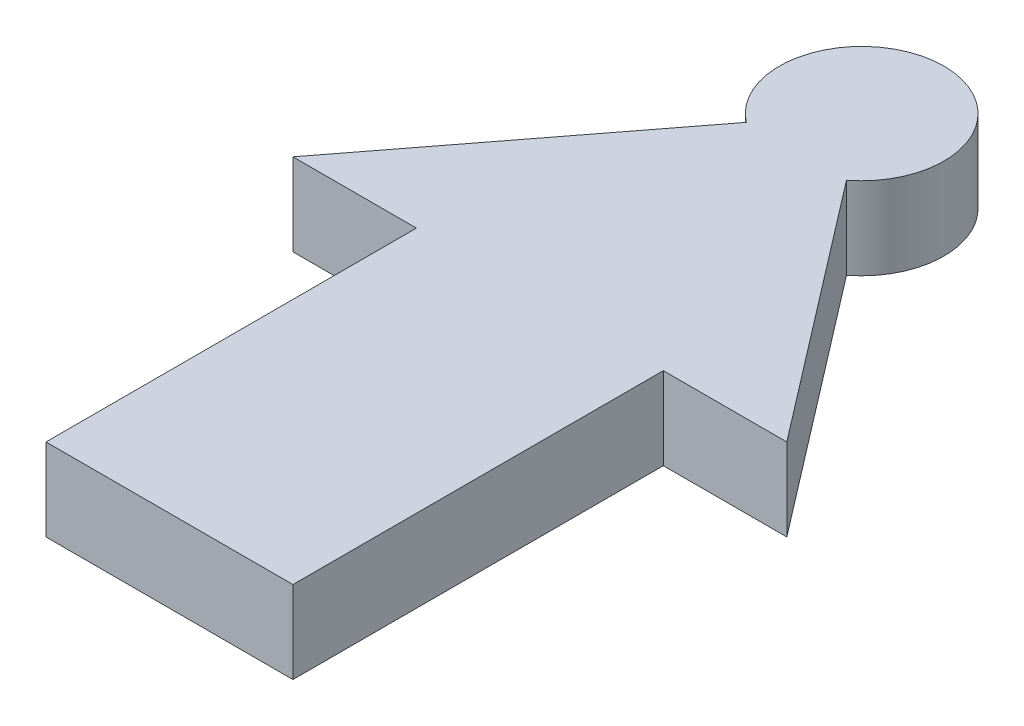
ISO-10303-21;
HEADER;
FILE_DESCRIPTION(('STEP AP214'),'2;1');
FILE_NAME('part.step','',(''),(''),'','','');
FILE_SCHEMA(('AUTOMOTIVE_DESIGN { 1 0 10303 214 1 1 1 1 }'));
ENDSEC;
DATA;
#1=APPLICATION_CONTEXT('core data for automotive mechanical design processes');
#2=APPLICATION_PROTOCOL_DEFINITION('international standard','automotive_design',2000,#1);
#3=PRODUCT_CONTEXT('',#1,'mechanical');
#4=PRODUCT('Part','Part','',(#3));
#5=PRODUCT_RELATED_PRODUCT_CATEGORY('part','',(#4));
#6=PRODUCT_DEFINITION_FORMATION('','',#4);
#7=PRODUCT_DEFINITION_CONTEXT('part definition',#1,'design');
#8=PRODUCT_DEFINITION('design','',#6,#7);
#9=PRODUCT_DEFINITION_SHAPE('','',#8);
#10=(LENGTH_UNIT() NAMED_UNIT(*) SI_UNIT(.MILLI.,.METRE.));
#11=(NAMED_UNIT(*) PLANE_ANGLE_UNIT() SI_UNIT($,.RADIAN.));
#12=(NAMED_UNIT(*) SI_UNIT($,.STERADIAN.) SOLID_ANGLE_UNIT());
#13=UNCERTAINTY_MEASURE_WITH_UNIT(LENGTH_MEASURE(1.E-05),#10,'distance_accuracy_value','');
#14=(GEOMETRIC_REPRESENTATION_CONTEXT(3) GLOBAL_UNCERTAINTY_ASSIGNED_CONTEXT((#13)) GLOBAL_UNIT_ASSIGNED_CONTEXT((#10,
#11,#12)) REPRESENTATION_CONTEXT('',''));
#15=CARTESIAN_POINT('',(0.,0.,0.));
#16=DIRECTION('',(0.,0.,1.));
#17=DIRECTION('',(1.,0.,0.));
#18=AXIS2_PLACEMENT_3D('',#15,#16,#17);
#19=CARTESIAN_POINT('',(75.5623361046163,25.4,-57.9810197678088));
#20=DIRECTION('',(-0.793353340291236,0.,0.608761429008719));
#21=DIRECTION('',(0.608761429008719,0.,0.793353340291236));
#22=AXIS2_PLACEMENT_3D('',#19,#20,#21);
#23=PLANE('',#22);
#24=DIRECTION('',(-0.608761429008719,0.,-0.793353340291236));
#25=VECTOR('',#24,1.);
#26=CARTESIAN_POINT('',(75.5623361046163,0.,-57.9810197678088));
#27=LINE('',#26,#25);
#28=CARTESIAN_POINT('',(76.2,0.,-57.15));
#29=VERTEX_POINT('',#28);
#30=CARTESIAN_POINT('',(15.4625402968215,0.,-136.304598567103));
#31=VERTEX_POINT('',#30);
#32=EDGE_CURVE('E146',#29,#31,#27,.T.);
#33=ORIENTED_EDGE('',*,*,#32,.T.);
#34=DIRECTION('',(0.,-1.,0.));
#35=VECTOR('',#34,1.);
#36=CARTESIAN_POINT('',(15.4625402968215,25.4,-136.304598567103));
#37=LINE('',#36,#35);
#38=CARTESIAN_POINT('',(15.4625402968215,25.4,-136.304598567103));
#39=VERTEX_POINT('',#38);
#40=EDGE_CURVE('E11',#39,#31,#37,.T.);
#41=ORIENTED_EDGE('',*,*,#40,.F.);
#42=DIRECTION('',(-0.608761429008719,0.,-0.793353340291236));
#43=VECTOR('',#42,1.);
#44=CARTESIAN_POINT('',(75.5623361046163,25.4,-57.9810197678088));
#45=LINE('',#44,#43);
#46=CARTESIAN_POINT('',(76.2,25.4,-57.15));
#47=VERTEX_POINT('',#46);
#48=EDGE_CURVE('E208',#47,#39,#45,.T.);
#49=ORIENTED_EDGE('',*,*,#48,.F.);
#50=DIRECTION('',(0.,-1.,0.));
#51=VECTOR('',#50,1.);
#52=CARTESIAN_POINT('',(76.2,25.4,-57.15));
#53=LINE('',#52,#51);
#54=EDGE_CURVE('E141',#47,#29,#53,.T.);
#55=ORIENTED_EDGE('',*,*,#54,.T.);
#56=EDGE_LOOP('',(#33,#41,#49,#55));
#57=FACE_BOUND('',#56,.T.);
#58=ADVANCED_FACE('F45',(#57),#23,.F.);
#59=CARTESIAN_POINT('',(0.,25.4,-156.4557734105));
#60=DIRECTION('',(0.,-1.,0.));
#61=DIRECTION('',(0.,0.,-1.));
#62=AXIS2_PLACEMENT_3D('',#59,#60,#61);
#63=CYLINDRICAL_SURFACE('',#62,25.4);
#64=CARTESIAN_POINT('',(0.,0.,-156.4557734105));
#65=DIRECTION('',(0.,1.,0.));
#66=DIRECTION('',(0.,0.,1.));
#67=AXIS2_PLACEMENT_3D('',#64,#65,#66);
#68=CIRCLE('',#67,25.4);
#69=CARTESIAN_POINT('',(-15.4625402968215,0.,-136.304598567103));
#70=VERTEX_POINT('',#69);
#71=EDGE_CURVE('E150',#31,#70,#68,.T.);
#72=ORIENTED_EDGE('',*,*,#71,.T.);
#73=DIRECTION('',(0.,-1.,0.));
#74=VECTOR('',#73,1.);
#75=CARTESIAN_POINT('',(-15.4625402968215,25.4,-136.304598567103));
#76=LINE('',#75,#74);
#77=CARTESIAN_POINT('',(-15.4625402968215,25.4,-136.304598567103));
#78=VERTEX_POINT('',#77);
#79=EDGE_CURVE('E54',#78,#70,#76,.T.);
#80=ORIENTED_EDGE('',*,*,#79,.F.);
#81=CARTESIAN_POINT('',(0.,25.4,-156.4557734105));
#82=DIRECTION('',(0.,1.,0.));
#83=DIRECTION('',(0.,0.,1.));
#84=AXIS2_PLACEMENT_3D('',#81,#82,#83);
#85=CIRCLE('',#84,25.4);
#86=EDGE_CURVE('E101',#39,#78,#85,.T.);
#87=ORIENTED_EDGE('',*,*,#86,.F.);
#88=ORIENTED_EDGE('',*,*,#40,.T.);
#89=EDGE_LOOP('',(#72,#80,#87,#88));
#90=FACE_BOUND('',#89,.T.);
#91=ADVANCED_FACE('F188',(#90),#63,.T.);
#92=CARTESIAN_POINT('',(-75.5623361046163,25.4,-57.9810197678088));
#93=DIRECTION('',(-0.793353340291236,0.,-0.608761429008719));
#94=DIRECTION('',(-0.608761429008719,0.,0.793353340291236));
#95=AXIS2_PLACEMENT_3D('',#92,#93,#94);
#96=PLANE('',#95);
#97=DIRECTION('',(0.608761429008719,0.,-0.793353340291236));
#98=VECTOR('',#97,1.);
#99=CARTESIAN_POINT('',(-75.5623361046163,0.,-57.9810197678088));
#100=LINE('',#99,#98);
#101=CARTESIAN_POINT('',(-76.2,0.,-57.15));
#102=VERTEX_POINT('',#101);
#103=EDGE_CURVE('E154',#102,#70,#100,.T.);
#104=ORIENTED_EDGE('',*,*,#103,.F.);
#105=DIRECTION('',(0.,-1.,0.));
#106=VECTOR('',#105,1.);
#107=CARTESIAN_POINT('',(-76.2,25.4,-57.15));
#108=LINE('',#107,#106);
#109=CARTESIAN_POINT('',(-76.2,25.4,-57.15));
#110=VERTEX_POINT('',#109);
#111=EDGE_CURVE('E179',#110,#102,#108,.T.);
#112=ORIENTED_EDGE('',*,*,#111,.F.);
#113=DIRECTION('',(0.608761429008719,0.,-0.793353340291236));
#114=VECTOR('',#113,1.);
#115=CARTESIAN_POINT('',(-75.5623361046163,25.4,-57.9810197678088));
#116=LINE('',#115,#114);
#117=EDGE_CURVE('E187',#110,#78,#116,.T.);
#118=ORIENTED_EDGE('',*,*,#117,.T.);
#119=ORIENTED_EDGE('',*,*,#79,.T.);
#120=EDGE_LOOP('',(#104,#112,#118,#119));
#121=FACE_BOUND('',#120,.T.);
#122=ADVANCED_FACE('F185',(#121),#96,.T.);
#123=CARTESIAN_POINT('',(0.,25.4,-57.15));
#124=DIRECTION('',(0.,0.,-1.));
#125=DIRECTION('',(-1.,0.,0.));
#126=AXIS2_PLACEMENT_3D('',#123,#124,#125);
#127=PLANE('',#126);
#128=DIRECTION('',(1.,0.,0.));
#129=VECTOR('',#128,1.);
#130=CARTESIAN_POINT('',(0.,0.,-57.15));
#131=LINE('',#130,#129);
#132=CARTESIAN_POINT('',(-38.1,0.,-57.15));
#133=VERTEX_POINT('',#132);
#134=EDGE_CURVE('E158',#102,#133,#131,.T.);
#135=ORIENTED_EDGE('',*,*,#134,.T.);
#136=DIRECTION('',(0.,-1.,0.));
#137=VECTOR('',#136,1.);
#138=CARTESIAN_POINT('',(-38.1,25.4,-57.15));
#139=LINE('',#138,#137);
#140=CARTESIAN_POINT('',(-38.1,25.4,-57.15));
#141=VERTEX_POINT('',#140);
#142=EDGE_CURVE('E175',#141,#133,#139,.T.);
#143=ORIENTED_EDGE('',*,*,#142,.F.);
#144=DIRECTION('',(1.,0.,0.));
#145=VECTOR('',#144,1.);
#146=CARTESIAN_POINT('',(0.,25.4,-57.15));
#147=LINE('',#146,#145);
#148=EDGE_CURVE('E143',#110,#141,#147,.T.);
#149=ORIENTED_EDGE('',*,*,#148,.F.);
#150=ORIENTED_EDGE('',*,*,#111,.T.);
#151=EDGE_LOOP('',(#135,#143,#149,#150));
#152=FACE_BOUND('',#151,.T.);
#153=ADVANCED_FACE('F197',(#152),#127,.F.);
#154=CARTESIAN_POINT('',(-38.1,25.4,0.));
#155=DIRECTION('',(1.,0.,0.));
#156=DIRECTION('',(0.,0.,-1.));
#157=AXIS2_PLACEMENT_3D('',#154,#155,#156);
#158=PLANE('',#157);
#159=DIRECTION('',(0.,0.,1.));
#160=VECTOR('',#159,1.);
#161=CARTESIAN_POINT('',(-38.1,0.,0.));
#162=LINE('',#161,#160);
#163=CARTESIAN_POINT('',(-38.1,0.,57.15));
#164=VERTEX_POINT('',#163);
#165=EDGE_CURVE('E161',#133,#164,#162,.T.);
#166=ORIENTED_EDGE('',*,*,#165,.T.);
#167=DIRECTION('',(0.,-1.,0.));
#168=VECTOR('',#167,1.);
#169=CARTESIAN_POINT('',(-38.1,25.4,57.15));
#170=LINE('',#169,#168);
#171=CARTESIAN_POINT('',(-38.1,25.4,57.15));
#172=VERTEX_POINT('',#171);
#173=EDGE_CURVE('E135',#172,#164,#170,.T.);
#174=ORIENTED_EDGE('',*,*,#173,.F.);
#175=DIRECTION('',(0.,0.,1.));
#176=VECTOR('',#175,1.);
#177=CARTESIAN_POINT('',(-38.1,25.4,0.));
#178=LINE('',#177,#176);
#179=EDGE_CURVE('E120',#141,#172,#178,.T.);
#180=ORIENTED_EDGE('',*,*,#179,.F.);
#181=ORIENTED_EDGE('',*,*,#142,.T.);
#182=EDGE_LOOP('',(#166,#174,#180,#181));
#183=FACE_BOUND('',#182,.T.);
#184=ADVANCED_FACE('F200',(#183),#158,.F.);
#185=CARTESIAN_POINT('',(0.,25.4,57.15));
#186=DIRECTION('',(0.,0.,-1.));
#187=DIRECTION('',(-1.,0.,0.));
#188=AXIS2_PLACEMENT_3D('',#185,#186,#187);
#189=PLANE('',#188);
#190=DIRECTION('',(1.,0.,0.));
#191=VECTOR('',#190,1.);
#192=CARTESIAN_POINT('',(0.,0.,57.15));
#193=LINE('',#192,#191);
#194=CARTESIAN_POINT('',(38.1,0.,57.15));
#195=VERTEX_POINT('',#194);
#196=EDGE_CURVE('E130',#164,#195,#193,.T.);
#197=ORIENTED_EDGE('',*,*,#196,.T.);
#198=DIRECTION('',(0.,-1.,0.));
#199=VECTOR('',#198,1.);
#200=CARTESIAN_POINT('',(38.1,25.4,57.15));
#201=LINE('',#200,#199);
#202=CARTESIAN_POINT('',(38.1,25.4,57.15));
#203=VERTEX_POINT('',#202);
#204=EDGE_CURVE('E127',#203,#195,#201,.T.);
#205=ORIENTED_EDGE('',*,*,#204,.F.);
#206=DIRECTION('',(1.,0.,0.));
#207=VECTOR('',#206,1.);
#208=CARTESIAN_POINT('',(0.,25.4,57.15));
#209=LINE('',#208,#207);
#210=EDGE_CURVE('E114',#172,#203,#209,.T.);
#211=ORIENTED_EDGE('',*,*,#210,.F.);
#212=ORIENTED_EDGE('',*,*,#173,.T.);
#213=EDGE_LOOP('',(#197,#205,#211,#212));
#214=FACE_BOUND('',#213,.T.);
#215=ADVANCED_FACE('F128',(#214),#189,.F.);
#216=CARTESIAN_POINT('',(38.1,25.4,0.));
#217=DIRECTION('',(1.,0.,0.));
#218=DIRECTION('',(0.,0.,-1.));
#219=AXIS2_PLACEMENT_3D('',#216,#217,#218);
#220=PLANE('',#219);
#221=DIRECTION('',(0.,0.,1.));
#222=VECTOR('',#221,1.);
#223=CARTESIAN_POINT('',(38.1,0.,0.));
#224=LINE('',#223,#222);
#225=CARTESIAN_POINT('',(38.1,0.,-57.15));
#226=VERTEX_POINT('',#225);
#227=EDGE_CURVE('E166',#226,#195,#224,.T.);
#228=ORIENTED_EDGE('',*,*,#227,.F.);
#229=DIRECTION('',(0.,-1.,0.));
#230=VECTOR('',#229,1.);
#231=CARTESIAN_POINT('',(38.1,25.4,-57.15));
#232=LINE('',#231,#230);
#233=CARTESIAN_POINT('',(38.1,25.4,-57.15));
#234=VERTEX_POINT('',#233);
#235=EDGE_CURVE('E90',#234,#226,#232,.T.);
#236=ORIENTED_EDGE('',*,*,#235,.F.);
#237=DIRECTION('',(0.,0.,1.));
#238=VECTOR('',#237,1.);
#239=CARTESIAN_POINT('',(38.1,25.4,0.));
#240=LINE('',#239,#238);
#241=EDGE_CURVE('E118',#234,#203,#240,.T.);
#242=ORIENTED_EDGE('',*,*,#241,.T.);
#243=ORIENTED_EDGE('',*,*,#204,.T.);
#244=EDGE_LOOP('',(#228,#236,#242,#243));
#245=FACE_BOUND('',#244,.T.);
#246=ADVANCED_FACE('F137',(#245),#220,.T.);
#247=EDGE_CURVE('E93',#226,#29,#131,.T.);
#248=ORIENTED_EDGE('',*,*,#247,.T.);
#249=ORIENTED_EDGE('',*,*,#54,.F.);
#250=EDGE_CURVE('E62',#234,#47,#147,.T.);
#251=ORIENTED_EDGE('',*,*,#250,.F.);
#252=ORIENTED_EDGE('',*,*,#235,.T.);
#253=EDGE_LOOP('',(#248,#249,#251,#252));
#254=FACE_BOUND('',#253,.T.);
#255=ADVANCED_FACE('F213',(#254),#127,.F.);
#256=CARTESIAN_POINT('',(0.,25.4,0.));
#257=DIRECTION('',(0.,1.,0.));
#258=DIRECTION('',(0.,0.,1.));
#259=AXIS2_PLACEMENT_3D('',#256,#257,#258);
#260=PLANE('',#259);
#261=ORIENTED_EDGE('',*,*,#48,.T.);
#262=ORIENTED_EDGE('',*,*,#86,.T.);
#263=ORIENTED_EDGE('',*,*,#117,.F.);
#264=ORIENTED_EDGE('',*,*,#148,.T.);
#265=ORIENTED_EDGE('',*,*,#179,.T.);
#266=ORIENTED_EDGE('',*,*,#210,.T.);
#267=ORIENTED_EDGE('',*,*,#241,.F.);
#268=ORIENTED_EDGE('',*,*,#250,.T.);
#269=EDGE_LOOP('',(#261,#262,#263,#264,#265,#266,#267,#268));
#270=FACE_BOUND('',#269,.T.);
#271=ADVANCED_FACE('F116',(#270),#260,.T.);
#272=CARTESIAN_POINT('',(0.,0.,0.));
#273=DIRECTION('',(0.,1.,0.));
#274=DIRECTION('',(0.,0.,1.));
#275=AXIS2_PLACEMENT_3D('',#272,#273,#274);
#276=PLANE('',#275);
#277=ORIENTED_EDGE('',*,*,#32,.F.);
#278=ORIENTED_EDGE('',*,*,#247,.F.);
#279=ORIENTED_EDGE('',*,*,#227,.T.);
#280=ORIENTED_EDGE('',*,*,#196,.F.);
#281=ORIENTED_EDGE('',*,*,#165,.F.);
#282=ORIENTED_EDGE('',*,*,#134,.F.);
#283=ORIENTED_EDGE('',*,*,#103,.T.);
#284=ORIENTED_EDGE('',*,*,#71,.F.);
#285=EDGE_LOOP('',(#277,#278,#279,#280,#281,#282,#283,#284));
#286=FACE_BOUND('',#285,.T.);
#287=ADVANCED_FACE('F193',(#286),#276,.F.);
#288=CLOSED_SHELL('',(#58,#91,#122,#153,#184,#215,#246,#255,#271,#287));
#289=MANIFOLD_SOLID_BREP('B2',#288);
#290=ADVANCED_BREP_SHAPE_REPRESENTATION('',(#18,#289),#14);
#291=SHAPE_DEFINITION_REPRESENTATION(#9,#290);
ENDSEC;
END-ISO-10303-21;
